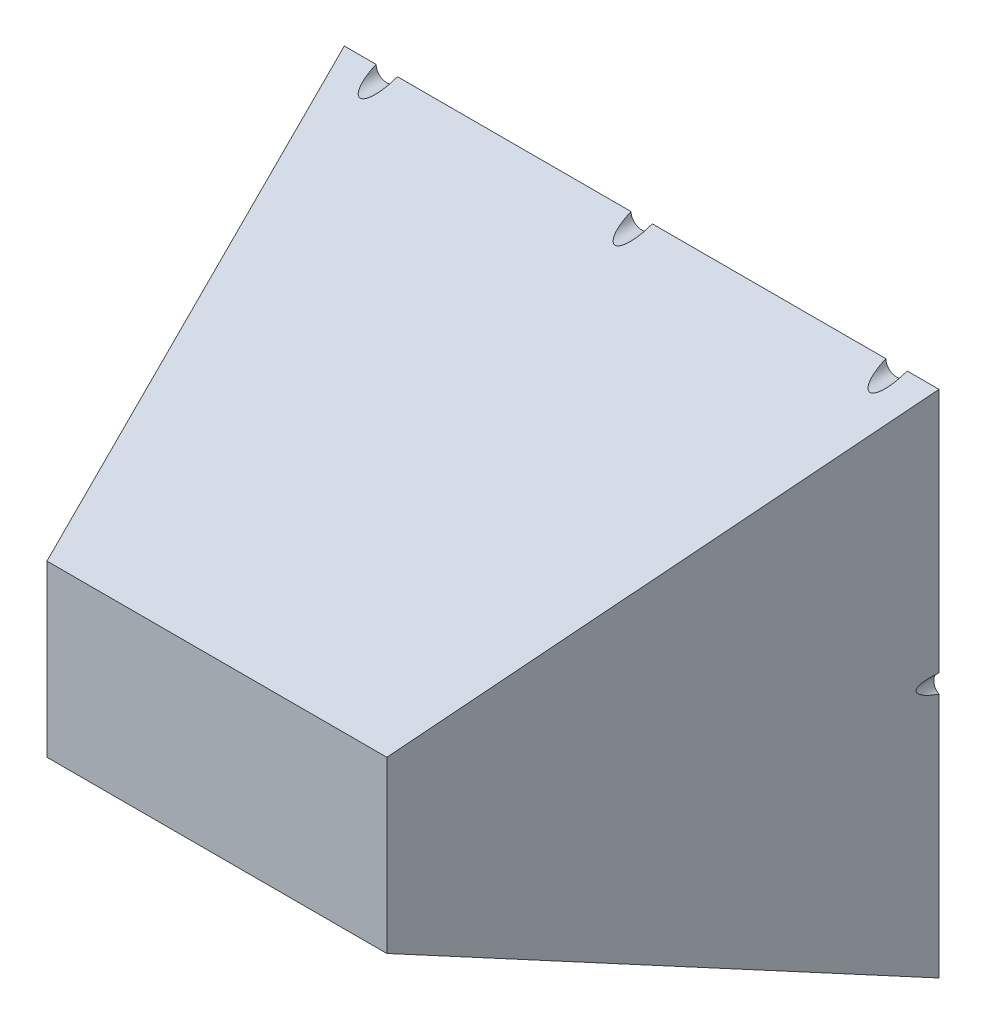
ISO-10303-21;
HEADER;
FILE_DESCRIPTION(('STEP AP214'),'2;1');
FILE_NAME('part.step','',(''),(''),'','','');
FILE_SCHEMA(('AUTOMOTIVE_DESIGN { 1 0 10303 214 1 1 1 1 }'));
ENDSEC;
DATA;
#1=APPLICATION_CONTEXT('core data for automotive mechanical design processes');
#2=APPLICATION_PROTOCOL_DEFINITION('international standard','automotive_design',2000,#1);
#3=PRODUCT_CONTEXT('',#1,'mechanical');
#4=PRODUCT('Part','Part','',(#3));
#5=PRODUCT_RELATED_PRODUCT_CATEGORY('part','',(#4));
#6=PRODUCT_DEFINITION_FORMATION('','',#4);
#7=PRODUCT_DEFINITION_CONTEXT('part definition',#1,'design');
#8=PRODUCT_DEFINITION('design','',#6,#7);
#9=PRODUCT_DEFINITION_SHAPE('','',#8);
#10=(LENGTH_UNIT() NAMED_UNIT(*) SI_UNIT(.MILLI.,.METRE.));
#11=(NAMED_UNIT(*) PLANE_ANGLE_UNIT() SI_UNIT($,.RADIAN.));
#12=(NAMED_UNIT(*) SI_UNIT($,.STERADIAN.) SOLID_ANGLE_UNIT());
#13=UNCERTAINTY_MEASURE_WITH_UNIT(LENGTH_MEASURE(1.E-05),#10,'distance_accuracy_value','');
#14=(GEOMETRIC_REPRESENTATION_CONTEXT(3) GLOBAL_UNCERTAINTY_ASSIGNED_CONTEXT((#13)) GLOBAL_UNIT_ASSIGNED_CONTEXT((#10,
#11,#12)) REPRESENTATION_CONTEXT('',''));
#15=CARTESIAN_POINT('',(0.,0.,0.));
#16=DIRECTION('',(0.,0.,1.));
#17=DIRECTION('',(1.,0.,0.));
#18=AXIS2_PLACEMENT_3D('',#15,#16,#17);
#19=CARTESIAN_POINT('',(0.,-50.7999999999999,254.));
#20=DIRECTION('',(0.,0.92847669088526,-0.371390676354101));
#21=DIRECTION('',(1.,0.,0.));
#22=AXIS2_PLACEMENT_3D('',#19,#20,#21);
#23=PLANE('',#22);
#24=DIRECTION('',(1.,0.,0.));
#25=VECTOR('',#24,1.);
#26=CARTESIAN_POINT('',(-177.8,-152.4,0.));
#27=LINE('',#26,#25);
#28=CARTESIAN_POINT('',(6.34999999999999,-152.4,0.));
#29=VERTEX_POINT('',#28);
#30=CARTESIAN_POINT('',(146.05,-152.399999999999,0.));
#31=VERTEX_POINT('',#30);
#32=EDGE_CURVE('E150',#29,#31,#27,.T.);
#33=ORIENTED_EDGE('',*,*,#32,.T.);
#34=CARTESIAN_POINT('',(152.4,-152.4,-2.27595720048157E-12));
#35=DIRECTION('',(0.,0.92847669088526,-0.371390676354101));
#36=DIRECTION('',(0.,-0.371390676354101,-0.92847669088526));
#37=AXIS2_PLACEMENT_3D('',#34,#35,#36);
#38=ELLIPSE('',#37,17.0978982626521,6.34999999999999);
#39=CARTESIAN_POINT('',(158.75,-152.4,0.));
#40=VERTEX_POINT('',#39);
#41=EDGE_CURVE('E11',#31,#40,#38,.T.);
#42=ORIENTED_EDGE('',*,*,#41,.T.);
#43=CARTESIAN_POINT('',(177.8,-152.4,0.));
#44=VERTEX_POINT('',#43);
#45=EDGE_CURVE('E148',#40,#44,#27,.T.);
#46=ORIENTED_EDGE('',*,*,#45,.T.);
#47=DIRECTION('',(-0.268328157299972,0.357770876399964,0.894427190999917));
#48=VECTOR('',#47,1.);
#49=CARTESIAN_POINT('',(94.2848,-41.0464,278.384));
#50=LINE('',#49,#48);
#51=CARTESIAN_POINT('',(101.6,-50.7999999999999,254.));
#52=VERTEX_POINT('',#51);
#53=EDGE_CURVE('E133',#44,#52,#50,.T.);
#54=ORIENTED_EDGE('',*,*,#53,.T.);
#55=DIRECTION('',(1.,0.,0.));
#56=VECTOR('',#55,1.);
#57=CARTESIAN_POINT('',(0.,-50.7999999999999,254.));
#58=LINE('',#57,#56);
#59=CARTESIAN_POINT('',(-101.6,-50.7999999999999,254.));
#60=VERTEX_POINT('',#59);
#61=EDGE_CURVE('E162',#60,#52,#58,.T.);
#62=ORIENTED_EDGE('',*,*,#61,.F.);
#63=DIRECTION('',(-0.268328157299972,-0.357770876399964,-0.894427190999917));
#64=VECTOR('',#63,1.);
#65=CARTESIAN_POINT('',(-94.2848,-41.0464,278.384));
#66=LINE('',#65,#64);
#67=CARTESIAN_POINT('',(-177.8,-152.4,0.));
#68=VERTEX_POINT('',#67);
#69=EDGE_CURVE('E175',#60,#68,#66,.T.);
#70=ORIENTED_EDGE('',*,*,#69,.T.);
#71=CARTESIAN_POINT('',(-158.75,-152.399999999999,0.));
#72=VERTEX_POINT('',#71);
#73=EDGE_CURVE('E152',#68,#72,#27,.T.);
#74=ORIENTED_EDGE('',*,*,#73,.T.);
#75=CARTESIAN_POINT('',(-152.4,-152.399999999999,3.33066907387547E-13));
#76=DIRECTION('',(0.,0.92847669088526,-0.371390676354101));
#77=DIRECTION('',(0.,-0.371390676354101,-0.92847669088526));
#78=AXIS2_PLACEMENT_3D('',#75,#76,#77);
#79=ELLIPSE('',#78,17.0978982626521,6.34999999999999);
#80=CARTESIAN_POINT('',(-146.05,-152.4,0.));
#81=VERTEX_POINT('',#80);
#82=EDGE_CURVE('E190',#72,#81,#79,.T.);
#83=ORIENTED_EDGE('',*,*,#82,.T.);
#84=CARTESIAN_POINT('',(-6.35,-152.399999999999,0.));
#85=VERTEX_POINT('',#84);
#86=EDGE_CURVE('E159',#81,#85,#27,.T.);
#87=ORIENTED_EDGE('',*,*,#86,.T.);
#88=CARTESIAN_POINT('',(0.,-152.4,-2.27595720048157E-12));
#89=DIRECTION('',(0.,0.92847669088526,-0.371390676354101));
#90=DIRECTION('',(0.,-0.371390676354101,-0.92847669088526));
#91=AXIS2_PLACEMENT_3D('',#88,#89,#90);
#92=ELLIPSE('',#91,17.0978982626522,6.35);
#93=EDGE_CURVE('E46',#85,#29,#92,.T.);
#94=ORIENTED_EDGE('',*,*,#93,.T.);
#95=EDGE_LOOP('',(#33,#42,#46,#54,#62,#70,#74,#83,#87,#94));
#96=FACE_BOUND('',#95,.T.);
#97=ADVANCED_FACE('F37',(#96),#23,.F.);
#98=CARTESIAN_POINT('',(0.,50.7999999999999,254.));
#99=DIRECTION('',(0.,-0.92847669088526,-0.371390676354101));
#100=DIRECTION('',(-1.,0.,0.));
#101=AXIS2_PLACEMENT_3D('',#98,#99,#100);
#102=PLANE('',#101);
#103=DIRECTION('',(-1.,0.,0.));
#104=VECTOR('',#103,1.);
#105=CARTESIAN_POINT('',(-177.8,152.4,0.));
#106=LINE('',#105,#104);
#107=CARTESIAN_POINT('',(-6.34999999999999,152.4,0.));
#108=VERTEX_POINT('',#107);
#109=CARTESIAN_POINT('',(-146.05,152.399999999999,0.));
#110=VERTEX_POINT('',#109);
#111=EDGE_CURVE('E216',#108,#110,#106,.T.);
#112=ORIENTED_EDGE('',*,*,#111,.T.);
#113=CARTESIAN_POINT('',(-152.4,152.399999999999,3.33066907387547E-13));
#114=DIRECTION('',(0.,-0.92847669088526,-0.371390676354101));
#115=DIRECTION('',(0.,0.371390676354101,-0.92847669088526));
#116=AXIS2_PLACEMENT_3D('',#113,#114,#115);
#117=ELLIPSE('',#116,17.0978982626521,6.34999999999999);
#118=CARTESIAN_POINT('',(-158.75,152.4,0.));
#119=VERTEX_POINT('',#118);
#120=EDGE_CURVE('E187',#110,#119,#117,.T.);
#121=ORIENTED_EDGE('',*,*,#120,.T.);
#122=CARTESIAN_POINT('',(-177.8,152.4,0.));
#123=VERTEX_POINT('',#122);
#124=EDGE_CURVE('E213',#119,#123,#106,.T.);
#125=ORIENTED_EDGE('',*,*,#124,.T.);
#126=DIRECTION('',(0.268328157299972,-0.357770876399964,0.894427190999917));
#127=VECTOR('',#126,1.);
#128=CARTESIAN_POINT('',(-94.2848,41.0464,278.384));
#129=LINE('',#128,#127);
#130=CARTESIAN_POINT('',(-101.6,50.7999999999999,254.));
#131=VERTEX_POINT('',#130);
#132=EDGE_CURVE('E147',#123,#131,#129,.T.);
#133=ORIENTED_EDGE('',*,*,#132,.T.);
#134=DIRECTION('',(-1.,0.,0.));
#135=VECTOR('',#134,1.);
#136=CARTESIAN_POINT('',(0.,50.7999999999999,254.));
#137=LINE('',#136,#135);
#138=CARTESIAN_POINT('',(101.6,50.7999999999999,254.));
#139=VERTEX_POINT('',#138);
#140=EDGE_CURVE('E158',#139,#131,#137,.T.);
#141=ORIENTED_EDGE('',*,*,#140,.F.);
#142=DIRECTION('',(0.268328157299972,0.357770876399964,-0.894427190999917));
#143=VECTOR('',#142,1.);
#144=CARTESIAN_POINT('',(94.2848,41.0464,278.384));
#145=LINE('',#144,#143);
#146=CARTESIAN_POINT('',(177.8,152.4,0.));
#147=VERTEX_POINT('',#146);
#148=EDGE_CURVE('E172',#139,#147,#145,.T.);
#149=ORIENTED_EDGE('',*,*,#148,.T.);
#150=CARTESIAN_POINT('',(158.75,152.399999999999,0.));
#151=VERTEX_POINT('',#150);
#152=EDGE_CURVE('E153',#147,#151,#106,.T.);
#153=ORIENTED_EDGE('',*,*,#152,.T.);
#154=CARTESIAN_POINT('',(152.4,152.4,-2.27595720048157E-12));
#155=DIRECTION('',(0.,-0.92847669088526,-0.371390676354101));
#156=DIRECTION('',(0.,0.371390676354101,-0.92847669088526));
#157=AXIS2_PLACEMENT_3D('',#154,#155,#156);
#158=ELLIPSE('',#157,17.0978982626521,6.34999999999999);
#159=CARTESIAN_POINT('',(146.05,152.4,0.));
#160=VERTEX_POINT('',#159);
#161=EDGE_CURVE('E184',#151,#160,#158,.T.);
#162=ORIENTED_EDGE('',*,*,#161,.T.);
#163=CARTESIAN_POINT('',(6.35,152.399999999999,0.));
#164=VERTEX_POINT('',#163);
#165=EDGE_CURVE('E228',#160,#164,#106,.T.);
#166=ORIENTED_EDGE('',*,*,#165,.T.);
#167=CARTESIAN_POINT('',(0.,152.4,-2.27595720048157E-12));
#168=DIRECTION('',(0.,-0.92847669088526,-0.371390676354101));
#169=DIRECTION('',(0.,0.371390676354101,-0.92847669088526));
#170=AXIS2_PLACEMENT_3D('',#167,#168,#169);
#171=ELLIPSE('',#170,17.0978982626522,6.35);
#172=EDGE_CURVE('E181',#164,#108,#171,.T.);
#173=ORIENTED_EDGE('',*,*,#172,.T.);
#174=EDGE_LOOP('',(#112,#121,#125,#133,#141,#149,#153,#162,#166,#173));
#175=FACE_BOUND('',#174,.T.);
#176=ADVANCED_FACE('F225',(#175),#102,.F.);
#177=CARTESIAN_POINT('',(101.6,0.,254.));
#178=DIRECTION('',(-0.957826285221152,0.,-0.287347885566343));
#179=DIRECTION('',(0.,1.,0.));
#180=AXIS2_PLACEMENT_3D('',#177,#178,#179);
#181=PLANE('',#180);
#182=DIRECTION('',(0.,1.,0.));
#183=VECTOR('',#182,1.);
#184=CARTESIAN_POINT('',(177.8,-152.4,0.));
#185=LINE('',#184,#183);
#186=CARTESIAN_POINT('',(177.799999999999,-5.49926131403066,0.));
#187=VERTEX_POINT('',#186);
#188=EDGE_CURVE('E211',#44,#187,#185,.T.);
#189=ORIENTED_EDGE('',*,*,#188,.T.);
#190=CARTESIAN_POINT('',(180.975,0.,-10.5833333333364));
#191=DIRECTION('',(-0.957826285221152,0.,-0.287347885566343));
#192=DIRECTION('',(0.287347885566343,0.,-0.957826285221152));
#193=AXIS2_PLACEMENT_3D('',#190,#191,#192);
#194=ELLIPSE('',#193,22.0986487771942,6.35);
#195=CARTESIAN_POINT('',(177.8,5.49926131403061,0.));
#196=VERTEX_POINT('',#195);
#197=EDGE_CURVE('E132',#187,#196,#194,.T.);
#198=ORIENTED_EDGE('',*,*,#197,.T.);
#199=EDGE_CURVE('E143',#196,#147,#185,.T.);
#200=ORIENTED_EDGE('',*,*,#199,.T.);
#201=ORIENTED_EDGE('',*,*,#148,.F.);
#202=DIRECTION('',(0.,1.,0.));
#203=VECTOR('',#202,1.);
#204=CARTESIAN_POINT('',(101.6,0.,254.));
#205=LINE('',#204,#203);
#206=EDGE_CURVE('E168',#52,#139,#205,.T.);
#207=ORIENTED_EDGE('',*,*,#206,.F.);
#208=ORIENTED_EDGE('',*,*,#53,.F.);
#209=EDGE_LOOP('',(#189,#198,#200,#201,#207,#208));
#210=FACE_BOUND('',#209,.T.);
#211=ADVANCED_FACE('F218',(#210),#181,.F.);
#212=CARTESIAN_POINT('',(-101.6,0.,254.));
#213=DIRECTION('',(0.957826285221152,0.,-0.287347885566343));
#214=DIRECTION('',(0.,-1.,0.));
#215=AXIS2_PLACEMENT_3D('',#212,#213,#214);
#216=PLANE('',#215);
#217=DIRECTION('',(0.,-1.,0.));
#218=VECTOR('',#217,1.);
#219=CARTESIAN_POINT('',(-177.8,-152.4,0.));
#220=LINE('',#219,#218);
#221=CARTESIAN_POINT('',(-177.799999999999,5.49926131403066,0.));
#222=VERTEX_POINT('',#221);
#223=EDGE_CURVE('E139',#123,#222,#220,.T.);
#224=ORIENTED_EDGE('',*,*,#223,.T.);
#225=CARTESIAN_POINT('',(-180.975,0.,-10.5833333333364));
#226=DIRECTION('',(0.957826285221152,0.,-0.287347885566343));
#227=DIRECTION('',(-0.287347885566343,0.,-0.957826285221152));
#228=AXIS2_PLACEMENT_3D('',#225,#226,#227);
#229=ELLIPSE('',#228,22.0986487771942,6.35);
#230=CARTESIAN_POINT('',(-177.8,-5.49926131403072,0.));
#231=VERTEX_POINT('',#230);
#232=EDGE_CURVE('E125',#222,#231,#229,.T.);
#233=ORIENTED_EDGE('',*,*,#232,.T.);
#234=EDGE_CURVE('E142',#231,#68,#220,.T.);
#235=ORIENTED_EDGE('',*,*,#234,.T.);
#236=ORIENTED_EDGE('',*,*,#69,.F.);
#237=DIRECTION('',(0.,-1.,0.));
#238=VECTOR('',#237,1.);
#239=CARTESIAN_POINT('',(-101.6,0.,254.));
#240=LINE('',#239,#238);
#241=EDGE_CURVE('E165',#131,#60,#240,.T.);
#242=ORIENTED_EDGE('',*,*,#241,.F.);
#243=ORIENTED_EDGE('',*,*,#132,.F.);
#244=EDGE_LOOP('',(#224,#233,#235,#236,#242,#243));
#245=FACE_BOUND('',#244,.T.);
#246=ADVANCED_FACE('F40',(#245),#216,.F.);
#247=CARTESIAN_POINT('',(0.,0.,254.));
#248=DIRECTION('',(0.,0.,-1.));
#249=DIRECTION('',(-1.,0.,0.));
#250=AXIS2_PLACEMENT_3D('',#247,#248,#249);
#251=PLANE('',#250);
#252=ORIENTED_EDGE('',*,*,#61,.T.);
#253=ORIENTED_EDGE('',*,*,#206,.T.);
#254=ORIENTED_EDGE('',*,*,#140,.T.);
#255=ORIENTED_EDGE('',*,*,#241,.T.);
#256=EDGE_LOOP('',(#252,#253,#254,#255));
#257=FACE_BOUND('',#256,.T.);
#258=ADVANCED_FACE('F273',(#257),#251,.F.);
#259=CARTESIAN_POINT('',(0.,0.,0.));
#260=DIRECTION('',(0.,0.,-1.));
#261=DIRECTION('',(-1.,0.,0.));
#262=AXIS2_PLACEMENT_3D('',#259,#260,#261);
#263=PLANE('',#262);
#264=ORIENTED_EDGE('',*,*,#234,.F.);
#265=CARTESIAN_POINT('',(-180.975,0.,0.));
#266=DIRECTION('',(0.,0.,1.));
#267=DIRECTION('',(1.,0.,0.));
#268=AXIS2_PLACEMENT_3D('',#265,#266,#267);
#269=CIRCLE('',#268,6.35);
#270=EDGE_CURVE('E128',#231,#222,#269,.T.);
#271=ORIENTED_EDGE('',*,*,#270,.T.);
#272=ORIENTED_EDGE('',*,*,#223,.F.);
#273=ORIENTED_EDGE('',*,*,#124,.F.);
#274=CARTESIAN_POINT('',(-152.4,152.399999999999,0.));
#275=DIRECTION('',(0.,0.,1.));
#276=DIRECTION('',(1.,0.,0.));
#277=AXIS2_PLACEMENT_3D('',#274,#275,#276);
#278=CIRCLE('',#277,6.34999999999999);
#279=EDGE_CURVE('E202',#119,#110,#278,.T.);
#280=ORIENTED_EDGE('',*,*,#279,.T.);
#281=ORIENTED_EDGE('',*,*,#111,.F.);
#282=CARTESIAN_POINT('',(0.,152.4,0.));
#283=DIRECTION('',(0.,0.,1.));
#284=DIRECTION('',(1.,0.,0.));
#285=AXIS2_PLACEMENT_3D('',#282,#283,#284);
#286=CIRCLE('',#285,6.35);
#287=EDGE_CURVE('E144',#108,#164,#286,.T.);
#288=ORIENTED_EDGE('',*,*,#287,.T.);
#289=ORIENTED_EDGE('',*,*,#165,.F.);
#290=CARTESIAN_POINT('',(152.4,152.4,0.));
#291=DIRECTION('',(0.,0.,1.));
#292=DIRECTION('',(1.,0.,0.));
#293=AXIS2_PLACEMENT_3D('',#290,#291,#292);
#294=CIRCLE('',#293,6.34999999999999);
#295=EDGE_CURVE('E207',#160,#151,#294,.T.);
#296=ORIENTED_EDGE('',*,*,#295,.T.);
#297=ORIENTED_EDGE('',*,*,#152,.F.);
#298=ORIENTED_EDGE('',*,*,#199,.F.);
#299=CARTESIAN_POINT('',(180.975,0.,0.));
#300=DIRECTION('',(0.,0.,1.));
#301=DIRECTION('',(-1.,0.,0.));
#302=AXIS2_PLACEMENT_3D('',#299,#300,#301);
#303=CIRCLE('',#302,6.35);
#304=EDGE_CURVE('E199',#196,#187,#303,.T.);
#305=ORIENTED_EDGE('',*,*,#304,.T.);
#306=ORIENTED_EDGE('',*,*,#188,.F.);
#307=ORIENTED_EDGE('',*,*,#45,.F.);
#308=CARTESIAN_POINT('',(152.4,-152.4,0.));
#309=DIRECTION('',(0.,0.,1.));
#310=DIRECTION('',(-1.,0.,0.));
#311=AXIS2_PLACEMENT_3D('',#308,#309,#310);
#312=CIRCLE('',#311,6.34999999999999);
#313=EDGE_CURVE('E52',#40,#31,#312,.T.);
#314=ORIENTED_EDGE('',*,*,#313,.T.);
#315=ORIENTED_EDGE('',*,*,#32,.F.);
#316=CARTESIAN_POINT('',(0.,-152.4,0.));
#317=DIRECTION('',(0.,0.,1.));
#318=DIRECTION('',(-1.,0.,0.));
#319=AXIS2_PLACEMENT_3D('',#316,#317,#318);
#320=CIRCLE('',#319,6.35);
#321=EDGE_CURVE('E58',#29,#85,#320,.T.);
#322=ORIENTED_EDGE('',*,*,#321,.T.);
#323=ORIENTED_EDGE('',*,*,#86,.F.);
#324=CARTESIAN_POINT('',(-152.4,-152.399999999999,0.));
#325=DIRECTION('',(0.,0.,1.));
#326=DIRECTION('',(-1.,0.,0.));
#327=AXIS2_PLACEMENT_3D('',#324,#325,#326);
#328=CIRCLE('',#327,6.34999999999999);
#329=EDGE_CURVE('E204',#81,#72,#328,.T.);
#330=ORIENTED_EDGE('',*,*,#329,.T.);
#331=ORIENTED_EDGE('',*,*,#73,.F.);
#332=EDGE_LOOP('',(#264,#271,#272,#273,#280,#281,#288,#289,#296,#297,#298,#305,#306,#307,#314,
#315,#322,#323,#330,#331));
#333=FACE_BOUND('',#332,.T.);
#334=ADVANCED_FACE('F137',(#333),#263,.T.);
#335=CARTESIAN_POINT('',(-180.975,0.,254.));
#336=DIRECTION('',(0.,0.,-1.));
#337=DIRECTION('',(-1.,0.,0.));
#338=AXIS2_PLACEMENT_3D('',#335,#336,#337);
#339=CYLINDRICAL_SURFACE('',#338,6.35);
#340=ORIENTED_EDGE('',*,*,#270,.F.);
#341=ORIENTED_EDGE('',*,*,#232,.F.);
#342=EDGE_LOOP('',(#340,#341));
#343=FACE_BOUND('',#342,.T.);
#344=ADVANCED_FACE('F127',(#343),#339,.F.);
#345=CARTESIAN_POINT('',(180.975,0.,254.));
#346=DIRECTION('',(0.,0.,-1.));
#347=DIRECTION('',(-1.,0.,0.));
#348=AXIS2_PLACEMENT_3D('',#345,#346,#347);
#349=CYLINDRICAL_SURFACE('',#348,6.35);
#350=ORIENTED_EDGE('',*,*,#304,.F.);
#351=ORIENTED_EDGE('',*,*,#197,.F.);
#352=EDGE_LOOP('',(#350,#351));
#353=FACE_BOUND('',#352,.T.);
#354=ADVANCED_FACE('F288',(#353),#349,.F.);
#355=CARTESIAN_POINT('',(0.,152.4,254.));
#356=DIRECTION('',(0.,0.,-1.));
#357=DIRECTION('',(-1.,0.,0.));
#358=AXIS2_PLACEMENT_3D('',#355,#356,#357);
#359=CYLINDRICAL_SURFACE('',#358,6.35);
#360=ORIENTED_EDGE('',*,*,#287,.F.);
#361=ORIENTED_EDGE('',*,*,#172,.F.);
#362=EDGE_LOOP('',(#360,#361));
#363=FACE_BOUND('',#362,.T.);
#364=ADVANCED_FACE('F247',(#363),#359,.F.);
#365=CARTESIAN_POINT('',(152.4,152.4,254.));
#366=DIRECTION('',(0.,0.,-1.));
#367=DIRECTION('',(-1.,0.,0.));
#368=AXIS2_PLACEMENT_3D('',#365,#366,#367);
#369=CYLINDRICAL_SURFACE('',#368,6.34999999999999);
#370=ORIENTED_EDGE('',*,*,#295,.F.);
#371=ORIENTED_EDGE('',*,*,#161,.F.);
#372=EDGE_LOOP('',(#370,#371));
#373=FACE_BOUND('',#372,.T.);
#374=ADVANCED_FACE('F238',(#373),#369,.F.);
#375=CARTESIAN_POINT('',(-152.4,152.399999999999,254.));
#376=DIRECTION('',(0.,0.,-1.));
#377=DIRECTION('',(-1.,0.,0.));
#378=AXIS2_PLACEMENT_3D('',#375,#376,#377);
#379=CYLINDRICAL_SURFACE('',#378,6.34999999999999);
#380=ORIENTED_EDGE('',*,*,#279,.F.);
#381=ORIENTED_EDGE('',*,*,#120,.F.);
#382=EDGE_LOOP('',(#380,#381));
#383=FACE_BOUND('',#382,.T.);
#384=ADVANCED_FACE('F235',(#383),#379,.F.);
#385=CARTESIAN_POINT('',(-152.4,-152.399999999999,254.));
#386=DIRECTION('',(0.,0.,-1.));
#387=DIRECTION('',(-1.,0.,0.));
#388=AXIS2_PLACEMENT_3D('',#385,#386,#387);
#389=CYLINDRICAL_SURFACE('',#388,6.34999999999999);
#390=ORIENTED_EDGE('',*,*,#329,.F.);
#391=ORIENTED_EDGE('',*,*,#82,.F.);
#392=EDGE_LOOP('',(#390,#391));
#393=FACE_BOUND('',#392,.T.);
#394=ADVANCED_FACE('F237',(#393),#389,.F.);
#395=CARTESIAN_POINT('',(0.,-152.4,254.));
#396=DIRECTION('',(0.,0.,-1.));
#397=DIRECTION('',(-1.,0.,0.));
#398=AXIS2_PLACEMENT_3D('',#395,#396,#397);
#399=CYLINDRICAL_SURFACE('',#398,6.35);
#400=ORIENTED_EDGE('',*,*,#321,.F.);
#401=ORIENTED_EDGE('',*,*,#93,.F.);
#402=EDGE_LOOP('',(#400,#401));
#403=FACE_BOUND('',#402,.T.);
#404=ADVANCED_FACE('F244',(#403),#399,.F.);
#405=CARTESIAN_POINT('',(152.4,-152.4,254.));
#406=DIRECTION('',(0.,0.,-1.));
#407=DIRECTION('',(-1.,0.,0.));
#408=AXIS2_PLACEMENT_3D('',#405,#406,#407);
#409=CYLINDRICAL_SURFACE('',#408,6.34999999999999);
#410=ORIENTED_EDGE('',*,*,#313,.F.);
#411=ORIENTED_EDGE('',*,*,#41,.F.);
#412=EDGE_LOOP('',(#410,#411));
#413=FACE_BOUND('',#412,.T.);
#414=ADVANCED_FACE('F284',(#413),#409,.F.);
#415=CLOSED_SHELL('',(#97,#176,#211,#246,#258,#334,#344,#354,#364,#374,#384,#394,#404,#414));
#416=MANIFOLD_SOLID_BREP('B2',#415);
#417=ADVANCED_BREP_SHAPE_REPRESENTATION('',(#18,#416),#14);
#418=SHAPE_DEFINITION_REPRESENTATION(#9,#417);
ENDSEC;
END-ISO-10303-21;
